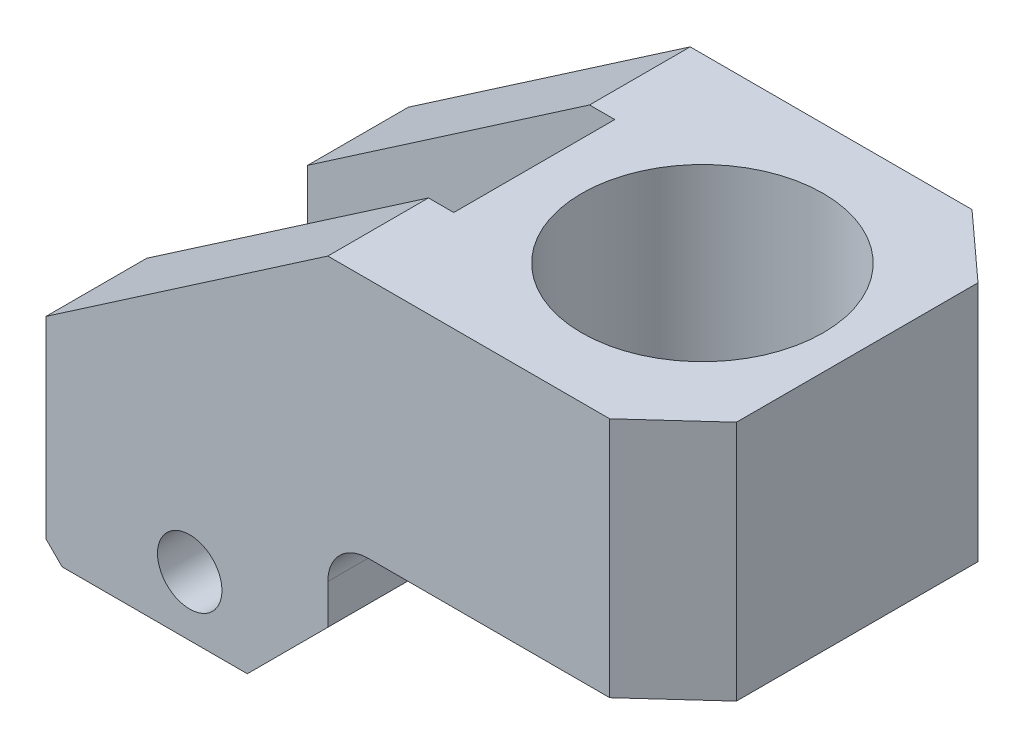
ISO-10303-21;
HEADER;
FILE_DESCRIPTION(('STEP AP214'),'2;1');
FILE_NAME('part.step','',(''),(''),'','','');
FILE_SCHEMA(('AUTOMOTIVE_DESIGN { 1 0 10303 214 1 1 1 1 }'));
ENDSEC;
DATA;
#1=APPLICATION_CONTEXT('core data for automotive mechanical design processes');
#2=APPLICATION_PROTOCOL_DEFINITION('international standard','automotive_design',2000,#1);
#3=PRODUCT_CONTEXT('',#1,'mechanical');
#4=PRODUCT('Part','Part','',(#3));
#5=PRODUCT_RELATED_PRODUCT_CATEGORY('part','',(#4));
#6=PRODUCT_DEFINITION_FORMATION('','',#4);
#7=PRODUCT_DEFINITION_CONTEXT('part definition',#1,'design');
#8=PRODUCT_DEFINITION('design','',#6,#7);
#9=PRODUCT_DEFINITION_SHAPE('','',#8);
#10=(LENGTH_UNIT() NAMED_UNIT(*) SI_UNIT(.MILLI.,.METRE.));
#11=(NAMED_UNIT(*) PLANE_ANGLE_UNIT() SI_UNIT($,.RADIAN.));
#12=(NAMED_UNIT(*) SI_UNIT($,.STERADIAN.) SOLID_ANGLE_UNIT());
#13=UNCERTAINTY_MEASURE_WITH_UNIT(LENGTH_MEASURE(1.E-05),#10,'distance_accuracy_value','');
#14=(GEOMETRIC_REPRESENTATION_CONTEXT(3) GLOBAL_UNCERTAINTY_ASSIGNED_CONTEXT((#13)) GLOBAL_UNIT_ASSIGNED_CONTEXT((#10,
#11,#12)) REPRESENTATION_CONTEXT('',''));
#15=CARTESIAN_POINT('',(0.,0.,0.));
#16=DIRECTION('',(0.,0.,1.));
#17=DIRECTION('',(1.,0.,0.));
#18=AXIS2_PLACEMENT_3D('',#15,#16,#17);
#19=CARTESIAN_POINT('',(-24.019063341913,30.,22.5));
#20=DIRECTION('',(-0.565326975135233,0.824866905133457,0.));
#21=DIRECTION('',(-0.824866905133457,-0.565326975135233,0.));
#22=AXIS2_PLACEMENT_3D('',#19,#20,#21);
#23=PLANE('',#22);
#24=DIRECTION('',(0.824866905133457,0.565326975135233,0.));
#25=VECTOR('',#24,1.);
#26=CARTESIAN_POINT('',(-24.019063341913,30.,10.));
#27=LINE('',#26,#25);
#28=CARTESIAN_POINT('',(-59.019063341913,6.01256153375207,10.));
#29=VERTEX_POINT('',#28);
#30=CARTESIAN_POINT('',(-24.019063341913,30.,10.));
#31=VERTEX_POINT('',#30);
#32=EDGE_CURVE('E209',#29,#31,#27,.T.);
#33=ORIENTED_EDGE('',*,*,#32,.F.);
#34=DIRECTION('',(0.,0.,-1.));
#35=VECTOR('',#34,1.);
#36=CARTESIAN_POINT('',(-59.019063341913,6.01256153375207,22.5));
#37=LINE('',#36,#35);
#38=CARTESIAN_POINT('',(-59.019063341913,6.01256153375207,22.5));
#39=VERTEX_POINT('',#38);
#40=EDGE_CURVE('E263',#39,#29,#37,.T.);
#41=ORIENTED_EDGE('',*,*,#40,.F.);
#42=DIRECTION('',(0.824866905133457,0.565326975135233,0.));
#43=VECTOR('',#42,1.);
#44=CARTESIAN_POINT('',(-24.019063341913,30.,22.5));
#45=LINE('',#44,#43);
#46=CARTESIAN_POINT('',(-24.019063341913,30.,22.5));
#47=VERTEX_POINT('',#46);
#48=EDGE_CURVE('E212',#39,#47,#45,.T.);
#49=ORIENTED_EDGE('',*,*,#48,.T.);
#50=DIRECTION('',(0.,0.,1.));
#51=VECTOR('',#50,1.);
#52=CARTESIAN_POINT('',(-24.019063341913,30.,-22.5));
#53=LINE('',#52,#51);
#54=EDGE_CURVE('E282',#31,#47,#53,.T.);
#55=ORIENTED_EDGE('',*,*,#54,.F.);
#56=EDGE_LOOP('',(#33,#41,#49,#55));
#57=FACE_BOUND('',#56,.T.);
#58=ADVANCED_FACE('F31',(#57),#23,.T.);
#59=CARTESIAN_POINT('',(-59.019063341913,-19.9275306984768,22.5));
#60=DIRECTION('',(-1.,0.,0.));
#61=DIRECTION('',(0.,0.,1.));
#62=AXIS2_PLACEMENT_3D('',#59,#60,#61);
#63=PLANE('',#62);
#64=DIRECTION('',(0.,1.,0.));
#65=VECTOR('',#64,1.);
#66=CARTESIAN_POINT('',(-59.019063341913,-19.9275306984768,10.));
#67=LINE('',#66,#65);
#68=CARTESIAN_POINT('',(-59.019063341913,-17.9275306984768,10.));
#69=VERTEX_POINT('',#68);
#70=EDGE_CURVE('E202',#69,#29,#67,.T.);
#71=ORIENTED_EDGE('',*,*,#70,.F.);
#72=DIRECTION('',(0.,0.,1.));
#73=VECTOR('',#72,1.);
#74=CARTESIAN_POINT('',(-59.019063341913,-17.9275306984768,22.5));
#75=LINE('',#74,#73);
#76=CARTESIAN_POINT('',(-59.019063341913,-17.9275306984768,22.5));
#77=VERTEX_POINT('',#76);
#78=EDGE_CURVE('E579',#69,#77,#75,.T.);
#79=ORIENTED_EDGE('',*,*,#78,.T.);
#80=DIRECTION('',(0.,1.,0.));
#81=VECTOR('',#80,1.);
#82=CARTESIAN_POINT('',(-59.019063341913,-19.9275306984768,22.5));
#83=LINE('',#82,#81);
#84=EDGE_CURVE('E608',#77,#39,#83,.T.);
#85=ORIENTED_EDGE('',*,*,#84,.T.);
#86=ORIENTED_EDGE('',*,*,#40,.T.);
#87=EDGE_LOOP('',(#71,#79,#85,#86));
#88=FACE_BOUND('',#87,.T.);
#89=ADVANCED_FACE('F362',(#88),#63,.T.);
#90=CARTESIAN_POINT('',(-59.019063341913,-19.9275306984768,22.5));
#91=DIRECTION('',(0.,-1.,0.));
#92=DIRECTION('',(0.,0.,-1.));
#93=AXIS2_PLACEMENT_3D('',#90,#91,#92);
#94=PLANE('',#93);
#95=DIRECTION('',(-1.,0.,0.));
#96=VECTOR('',#95,1.);
#97=CARTESIAN_POINT('',(-59.019063341913,-19.9275306984768,10.));
#98=LINE('',#97,#96);
#99=CARTESIAN_POINT('',(-34.019063341913,-19.9275306984768,10.));
#100=VERTEX_POINT('',#99);
#101=CARTESIAN_POINT('',(-57.019063341913,-19.9275306984768,10.));
#102=VERTEX_POINT('',#101);
#103=EDGE_CURVE('E199',#100,#102,#98,.T.);
#104=ORIENTED_EDGE('',*,*,#103,.F.);
#105=DIRECTION('',(0.,0.,1.));
#106=VECTOR('',#105,1.);
#107=CARTESIAN_POINT('',(-34.019063341913,-19.9275306984768,22.5));
#108=LINE('',#107,#106);
#109=CARTESIAN_POINT('',(-34.019063341913,-19.9275306984768,22.5));
#110=VERTEX_POINT('',#109);
#111=EDGE_CURVE('E39',#100,#110,#108,.T.);
#112=ORIENTED_EDGE('',*,*,#111,.T.);
#113=DIRECTION('',(-1.,0.,0.));
#114=VECTOR('',#113,1.);
#115=CARTESIAN_POINT('',(-59.019063341913,-19.9275306984768,22.5));
#116=LINE('',#115,#114);
#117=CARTESIAN_POINT('',(-57.019063341913,-19.9275306984768,22.5));
#118=VERTEX_POINT('',#117);
#119=EDGE_CURVE('E219',#110,#118,#116,.T.);
#120=ORIENTED_EDGE('',*,*,#119,.T.);
#121=DIRECTION('',(0.,0.,-1.));
#122=VECTOR('',#121,1.);
#123=CARTESIAN_POINT('',(-57.019063341913,-19.9275306984768,22.5));
#124=LINE('',#123,#122);
#125=EDGE_CURVE('E574',#118,#102,#124,.T.);
#126=ORIENTED_EDGE('',*,*,#125,.T.);
#127=EDGE_LOOP('',(#104,#112,#120,#126));
#128=FACE_BOUND('',#127,.T.);
#129=ADVANCED_FACE('F368',(#128),#94,.T.);
#130=CARTESIAN_POINT('',(-24.019063341913,-19.9275306984768,22.5));
#131=DIRECTION('',(1.,0.,0.));
#132=DIRECTION('',(0.,0.,-1.));
#133=AXIS2_PLACEMENT_3D('',#130,#131,#132);
#134=PLANE('',#133);
#135=DIRECTION('',(0.,-1.,0.));
#136=VECTOR('',#135,1.);
#137=CARTESIAN_POINT('',(-24.019063341913,-19.9275306984768,22.5));
#138=LINE('',#137,#136);
#139=CARTESIAN_POINT('',(-24.019063341913,-5.,22.5));
#140=VERTEX_POINT('',#139);
#141=CARTESIAN_POINT('',(-24.019063341913,-9.92753069847682,22.5));
#142=VERTEX_POINT('',#141);
#143=EDGE_CURVE('E215',#140,#142,#138,.T.);
#144=ORIENTED_EDGE('',*,*,#143,.T.);
#145=DIRECTION('',(0.,0.,-1.));
#146=VECTOR('',#145,1.);
#147=CARTESIAN_POINT('',(-24.019063341913,-9.92753069847682,22.5));
#148=LINE('',#147,#146);
#149=CARTESIAN_POINT('',(-24.019063341913,-9.92753069847682,10.));
#150=VERTEX_POINT('',#149);
#151=EDGE_CURVE('E549',#142,#150,#148,.T.);
#152=ORIENTED_EDGE('',*,*,#151,.T.);
#153=DIRECTION('',(0.,-1.,0.));
#154=VECTOR('',#153,1.);
#155=CARTESIAN_POINT('',(-24.019063341913,-19.9275306984768,10.));
#156=LINE('',#155,#154);
#157=CARTESIAN_POINT('',(-24.019063341913,-5.,10.));
#158=VERTEX_POINT('',#157);
#159=EDGE_CURVE('E248',#158,#150,#156,.T.);
#160=ORIENTED_EDGE('',*,*,#159,.F.);
#161=DIRECTION('',(0.,0.,-1.));
#162=VECTOR('',#161,1.);
#163=CARTESIAN_POINT('',(-24.019063341913,-5.,16.25));
#164=LINE('',#163,#162);
#165=EDGE_CURVE('E227',#158,#140,#164,.F.);
#166=ORIENTED_EDGE('',*,*,#165,.T.);
#167=EDGE_LOOP('',(#144,#152,#160,#166));
#168=FACE_BOUND('',#167,.T.);
#169=ADVANCED_FACE('F478',(#168),#134,.T.);
#170=CARTESIAN_POINT('',(10.9809366580871,30.,22.5));
#171=DIRECTION('',(-0.67300654170394,0.,-0.739636528859752));
#172=DIRECTION('',(-0.739636528859752,0.,0.67300654170394));
#173=AXIS2_PLACEMENT_3D('',#170,#171,#172);
#174=PLANE('',#173);
#175=DIRECTION('',(0.739636528859752,0.,-0.67300654170394));
#176=VECTOR('',#175,1.);
#177=CARTESIAN_POINT('',(10.9809366580871,0.,22.5));
#178=LINE('',#177,#176);
#179=CARTESIAN_POINT('',(10.9809366580871,0.,22.5));
#180=VERTEX_POINT('',#179);
#181=CARTESIAN_POINT('',(19.2234627298298,0.,15.));
#182=VERTEX_POINT('',#181);
#183=EDGE_CURVE('E271',#180,#182,#178,.T.);
#184=ORIENTED_EDGE('',*,*,#183,.T.);
#185=DIRECTION('',(0.,-1.,0.));
#186=VECTOR('',#185,1.);
#187=CARTESIAN_POINT('',(19.2234627298298,30.,15.));
#188=LINE('',#187,#186);
#189=CARTESIAN_POINT('',(19.2234627298298,30.,15.));
#190=VERTEX_POINT('',#189);
#191=EDGE_CURVE('E239',#190,#182,#188,.T.);
#192=ORIENTED_EDGE('',*,*,#191,.F.);
#193=DIRECTION('',(0.739636528859752,0.,-0.67300654170394));
#194=VECTOR('',#193,1.);
#195=CARTESIAN_POINT('',(10.9809366580871,30.,22.5));
#196=LINE('',#195,#194);
#197=CARTESIAN_POINT('',(10.9809366580871,30.,22.5));
#198=VERTEX_POINT('',#197);
#199=EDGE_CURVE('E233',#198,#190,#196,.T.);
#200=ORIENTED_EDGE('',*,*,#199,.F.);
#201=DIRECTION('',(0.,-1.,0.));
#202=VECTOR('',#201,1.);
#203=CARTESIAN_POINT('',(10.9809366580871,30.,22.5));
#204=LINE('',#203,#202);
#205=EDGE_CURVE('E286',#198,#180,#204,.T.);
#206=ORIENTED_EDGE('',*,*,#205,.T.);
#207=EDGE_LOOP('',(#184,#192,#200,#206));
#208=FACE_BOUND('',#207,.T.);
#209=ADVANCED_FACE('F309',(#208),#174,.F.);
#210=CARTESIAN_POINT('',(19.2234627298298,30.,-15.));
#211=DIRECTION('',(-1.,0.,0.));
#212=DIRECTION('',(0.,0.,1.));
#213=AXIS2_PLACEMENT_3D('',#210,#211,#212);
#214=PLANE('',#213);
#215=DIRECTION('',(0.,0.,-1.));
#216=VECTOR('',#215,1.);
#217=CARTESIAN_POINT('',(19.2234627298298,0.,-15.));
#218=LINE('',#217,#216);
#219=CARTESIAN_POINT('',(19.2234627298298,0.,-15.));
#220=VERTEX_POINT('',#219);
#221=EDGE_CURVE('E289',#182,#220,#218,.T.);
#222=ORIENTED_EDGE('',*,*,#221,.T.);
#223=DIRECTION('',(0.,-1.,0.));
#224=VECTOR('',#223,1.);
#225=CARTESIAN_POINT('',(19.2234627298298,30.,-15.));
#226=LINE('',#225,#224);
#227=CARTESIAN_POINT('',(19.2234627298298,30.,-15.));
#228=VERTEX_POINT('',#227);
#229=EDGE_CURVE('E296',#228,#220,#226,.T.);
#230=ORIENTED_EDGE('',*,*,#229,.F.);
#231=DIRECTION('',(0.,0.,-1.));
#232=VECTOR('',#231,1.);
#233=CARTESIAN_POINT('',(19.2234627298298,30.,-15.));
#234=LINE('',#233,#232);
#235=EDGE_CURVE('E276',#190,#228,#234,.T.);
#236=ORIENTED_EDGE('',*,*,#235,.F.);
#237=ORIENTED_EDGE('',*,*,#191,.T.);
#238=EDGE_LOOP('',(#222,#230,#236,#237));
#239=FACE_BOUND('',#238,.T.);
#240=ADVANCED_FACE('F305',(#239),#214,.F.);
#241=CARTESIAN_POINT('',(10.9809366580871,30.,-22.5));
#242=DIRECTION('',(-0.67300654170394,0.,0.739636528859752));
#243=DIRECTION('',(0.739636528859752,0.,0.67300654170394));
#244=AXIS2_PLACEMENT_3D('',#241,#242,#243);
#245=PLANE('',#244);
#246=DIRECTION('',(-0.739636528859752,0.,-0.67300654170394));
#247=VECTOR('',#246,1.);
#248=CARTESIAN_POINT('',(10.9809366580871,0.,-22.5));
#249=LINE('',#248,#247);
#250=CARTESIAN_POINT('',(10.9809366580871,0.,-22.5));
#251=VERTEX_POINT('',#250);
#252=EDGE_CURVE('E243',#220,#251,#249,.T.);
#253=ORIENTED_EDGE('',*,*,#252,.T.);
#254=DIRECTION('',(0.,-1.,0.));
#255=VECTOR('',#254,1.);
#256=CARTESIAN_POINT('',(10.9809366580871,30.,-22.5));
#257=LINE('',#256,#255);
#258=CARTESIAN_POINT('',(10.9809366580871,30.,-22.5));
#259=VERTEX_POINT('',#258);
#260=EDGE_CURVE('E294',#259,#251,#257,.T.);
#261=ORIENTED_EDGE('',*,*,#260,.F.);
#262=DIRECTION('',(-0.739636528859752,0.,-0.67300654170394));
#263=VECTOR('',#262,1.);
#264=CARTESIAN_POINT('',(10.9809366580871,30.,-22.5));
#265=LINE('',#264,#263);
#266=EDGE_CURVE('E278',#228,#259,#265,.T.);
#267=ORIENTED_EDGE('',*,*,#266,.F.);
#268=ORIENTED_EDGE('',*,*,#229,.T.);
#269=EDGE_LOOP('',(#253,#261,#267,#268));
#270=FACE_BOUND('',#269,.T.);
#271=ADVANCED_FACE('F318',(#270),#245,.F.);
#272=CARTESIAN_POINT('',(-24.019063341913,30.,-22.5));
#273=DIRECTION('',(0.,0.,1.));
#274=DIRECTION('',(1.,0.,0.));
#275=AXIS2_PLACEMENT_3D('',#272,#273,#274);
#276=PLANE('',#275);
#277=CARTESIAN_POINT('',(-41.1704943946339,-12.5474412438957,-22.5));
#278=DIRECTION('',(0.,0.,-1.));
#279=DIRECTION('',(-1.,0.,0.));
#280=AXIS2_PLACEMENT_3D('',#277,#278,#279);
#281=CIRCLE('',#280,3.99999999676854);
#282=CARTESIAN_POINT('',(-45.1704943914024,-12.5474412438957,-22.5));
#283=VERTEX_POINT('',#282);
#284=EDGE_CURVE('E253',#283,#283,#281,.T.);
#285=ORIENTED_EDGE('',*,*,#284,.F.);
#286=EDGE_LOOP('',(#285));
#287=FACE_BOUND('',#286,.T.);
#288=DIRECTION('',(0.,-1.,0.));
#289=VECTOR('',#288,1.);
#290=CARTESIAN_POINT('',(-24.019063341913,-19.9275306984768,-22.5));
#291=LINE('',#290,#289);
#292=CARTESIAN_POINT('',(-24.019063341913,-5.,-22.5));
#293=VERTEX_POINT('',#292);
#294=CARTESIAN_POINT('',(-24.019063341913,-9.92753069847682,-22.5));
#295=VERTEX_POINT('',#294);
#296=EDGE_CURVE('E254',#293,#295,#291,.T.);
#297=ORIENTED_EDGE('',*,*,#296,.T.);
#298=DIRECTION('',(0.707106781186549,0.707106781186546,0.));
#299=VECTOR('',#298,1.);
#300=CARTESIAN_POINT('',(-24.019063341913,-9.92753069847682,-22.5));
#301=LINE('',#300,#299);
#302=CARTESIAN_POINT('',(-34.019063341913,-19.9275306984768,-22.5));
#303=VERTEX_POINT('',#302);
#304=EDGE_CURVE('E586',#295,#303,#301,.F.);
#305=ORIENTED_EDGE('',*,*,#304,.T.);
#306=DIRECTION('',(-1.,0.,0.));
#307=VECTOR('',#306,1.);
#308=CARTESIAN_POINT('',(-59.019063341913,-19.9275306984768,-22.5));
#309=LINE('',#308,#307);
#310=CARTESIAN_POINT('',(-57.019063341913,-19.9275306984768,-22.5));
#311=VERTEX_POINT('',#310);
#312=EDGE_CURVE('E257',#303,#311,#309,.T.);
#313=ORIENTED_EDGE('',*,*,#312,.T.);
#314=DIRECTION('',(0.707106781186545,-0.70710678118655,0.));
#315=VECTOR('',#314,1.);
#316=CARTESIAN_POINT('',(-57.019063341913,-19.9275306984768,-22.5));
#317=LINE('',#316,#315);
#318=CARTESIAN_POINT('',(-59.019063341913,-17.9275306984768,-22.5));
#319=VERTEX_POINT('',#318);
#320=EDGE_CURVE('E569',#311,#319,#317,.F.);
#321=ORIENTED_EDGE('',*,*,#320,.T.);
#322=DIRECTION('',(0.,1.,0.));
#323=VECTOR('',#322,1.);
#324=CARTESIAN_POINT('',(-59.019063341913,-19.9275306984768,-22.5));
#325=LINE('',#324,#323);
#326=CARTESIAN_POINT('',(-59.019063341913,6.01256153375207,-22.5));
#327=VERTEX_POINT('',#326);
#328=EDGE_CURVE('E216',#319,#327,#325,.T.);
#329=ORIENTED_EDGE('',*,*,#328,.T.);
#330=DIRECTION('',(0.824866905133457,0.565326975135233,0.));
#331=VECTOR('',#330,1.);
#332=CARTESIAN_POINT('',(-24.019063341913,30.,-22.5));
#333=LINE('',#332,#331);
#334=CARTESIAN_POINT('',(-24.019063341913,30.,-22.5));
#335=VERTEX_POINT('',#334);
#336=EDGE_CURVE('E182',#327,#335,#333,.T.);
#337=ORIENTED_EDGE('',*,*,#336,.T.);
#338=DIRECTION('',(-1.,0.,0.));
#339=VECTOR('',#338,1.);
#340=CARTESIAN_POINT('',(-24.019063341913,30.,-22.5));
#341=LINE('',#340,#339);
#342=EDGE_CURVE('E280',#259,#335,#341,.T.);
#343=ORIENTED_EDGE('',*,*,#342,.F.);
#344=ORIENTED_EDGE('',*,*,#260,.T.);
#345=DIRECTION('',(-1.,0.,0.));
#346=VECTOR('',#345,1.);
#347=CARTESIAN_POINT('',(-24.019063341913,0.,-22.5));
#348=LINE('',#347,#346);
#349=CARTESIAN_POINT('',(-19.019063341913,0.,-22.5));
#350=VERTEX_POINT('',#349);
#351=EDGE_CURVE('E234',#251,#350,#348,.T.);
#352=ORIENTED_EDGE('',*,*,#351,.T.);
#353=CARTESIAN_POINT('',(-19.019063341913,-5.,-22.5));
#354=DIRECTION('',(0.,0.,1.));
#355=DIRECTION('',(1.,0.,0.));
#356=AXIS2_PLACEMENT_3D('',#353,#354,#355);
#357=CIRCLE('',#356,5.);
#358=EDGE_CURVE('E559',#350,#293,#357,.T.);
#359=ORIENTED_EDGE('',*,*,#358,.T.);
#360=EDGE_LOOP('',(#297,#305,#313,#321,#329,#337,#343,#344,#352,#359));
#361=FACE_BOUND('',#360,.T.);
#362=ADVANCED_FACE('F321',(#287,#361),#276,.F.);
#363=CARTESIAN_POINT('',(-24.019063341913,30.,22.5));
#364=DIRECTION('',(0.,0.,-1.));
#365=DIRECTION('',(-1.,0.,0.));
#366=AXIS2_PLACEMENT_3D('',#363,#364,#365);
#367=PLANE('',#366);
#368=CARTESIAN_POINT('',(-41.1704943946339,-12.5474412438957,22.5));
#369=DIRECTION('',(0.,0.,-1.));
#370=DIRECTION('',(-1.,0.,0.));
#371=AXIS2_PLACEMENT_3D('',#368,#369,#370);
#372=CIRCLE('',#371,3.99999999676854);
#373=CARTESIAN_POINT('',(-45.1704943914024,-12.5474412438957,22.5));
#374=VERTEX_POINT('',#373);
#375=EDGE_CURVE('E193',#374,#374,#372,.T.);
#376=ORIENTED_EDGE('',*,*,#375,.T.);
#377=EDGE_LOOP('',(#376));
#378=FACE_BOUND('',#377,.T.);
#379=ORIENTED_EDGE('',*,*,#119,.F.);
#380=DIRECTION('',(-0.707106781186549,-0.707106781186546,0.));
#381=VECTOR('',#380,1.);
#382=CARTESIAN_POINT('',(-24.019063341913,-9.92753069847682,22.5));
#383=LINE('',#382,#381);
#384=EDGE_CURVE('E11',#110,#142,#383,.F.);
#385=ORIENTED_EDGE('',*,*,#384,.T.);
#386=ORIENTED_EDGE('',*,*,#143,.F.);
#387=CARTESIAN_POINT('',(-19.019063341913,-5.,22.5));
#388=DIRECTION('',(0.,0.,-1.));
#389=DIRECTION('',(-1.,0.,0.));
#390=AXIS2_PLACEMENT_3D('',#387,#388,#389);
#391=CIRCLE('',#390,5.);
#392=CARTESIAN_POINT('',(-19.019063341913,0.,22.5));
#393=VERTEX_POINT('',#392);
#394=EDGE_CURVE('E558',#140,#393,#391,.T.);
#395=ORIENTED_EDGE('',*,*,#394,.T.);
#396=DIRECTION('',(1.,0.,0.));
#397=VECTOR('',#396,1.);
#398=CARTESIAN_POINT('',(-24.019063341913,0.,22.5));
#399=LINE('',#398,#397);
#400=EDGE_CURVE('E230',#393,#180,#399,.T.);
#401=ORIENTED_EDGE('',*,*,#400,.T.);
#402=ORIENTED_EDGE('',*,*,#205,.F.);
#403=DIRECTION('',(1.,0.,0.));
#404=VECTOR('',#403,1.);
#405=CARTESIAN_POINT('',(-24.019063341913,30.,22.5));
#406=LINE('',#405,#404);
#407=EDGE_CURVE('E284',#47,#198,#406,.T.);
#408=ORIENTED_EDGE('',*,*,#407,.F.);
#409=ORIENTED_EDGE('',*,*,#48,.F.);
#410=ORIENTED_EDGE('',*,*,#84,.F.);
#411=DIRECTION('',(-0.707106781186545,0.70710678118655,0.));
#412=VECTOR('',#411,1.);
#413=CARTESIAN_POINT('',(-57.019063341913,-19.9275306984768,22.5));
#414=LINE('',#413,#412);
#415=EDGE_CURVE('E581',#77,#118,#414,.F.);
#416=ORIENTED_EDGE('',*,*,#415,.T.);
#417=EDGE_LOOP('',(#379,#385,#386,#395,#401,#402,#408,#409,#410,#416));
#418=FACE_BOUND('',#417,.T.);
#419=ADVANCED_FACE('F352',(#378,#418),#367,.F.);
#420=CARTESIAN_POINT('',(35.7085148733153,30.,0.));
#421=DIRECTION('',(0.,-1.,0.));
#422=DIRECTION('',(0.,0.,-1.));
#423=AXIS2_PLACEMENT_3D('',#420,#421,#422);
#424=PLANE('',#423);
#425=CARTESIAN_POINT('',(0.,30.,0.));
#426=DIRECTION('',(0.,1.,0.));
#427=DIRECTION('',(0.,0.,1.));
#428=AXIS2_PLACEMENT_3D('',#425,#426,#427);
#429=CIRCLE('',#428,15.);
#430=CARTESIAN_POINT('',(0.,30.,15.));
#431=VERTEX_POINT('',#430);
#432=EDGE_CURVE('E266',#431,#431,#429,.T.);
#433=ORIENTED_EDGE('',*,*,#432,.F.);
#434=EDGE_LOOP('',(#433));
#435=FACE_BOUND('',#434,.T.);
#436=DIRECTION('',(0.,0.,1.));
#437=VECTOR('',#436,1.);
#438=CARTESIAN_POINT('',(-20.8824295978616,30.,0.));
#439=LINE('',#438,#437);
#440=CARTESIAN_POINT('',(-20.8824295978616,30.,-10.));
#441=VERTEX_POINT('',#440);
#442=CARTESIAN_POINT('',(-20.8824295978616,30.,10.));
#443=VERTEX_POINT('',#442);
#444=EDGE_CURVE('E172',#441,#443,#439,.T.);
#445=ORIENTED_EDGE('',*,*,#444,.T.);
#446=DIRECTION('',(-1.,0.,0.));
#447=VECTOR('',#446,1.);
#448=CARTESIAN_POINT('',(35.7085148733153,30.,10.));
#449=LINE('',#448,#447);
#450=EDGE_CURVE('E183',#443,#31,#449,.T.);
#451=ORIENTED_EDGE('',*,*,#450,.T.);
#452=ORIENTED_EDGE('',*,*,#54,.T.);
#453=ORIENTED_EDGE('',*,*,#407,.T.);
#454=ORIENTED_EDGE('',*,*,#199,.T.);
#455=ORIENTED_EDGE('',*,*,#235,.T.);
#456=ORIENTED_EDGE('',*,*,#266,.T.);
#457=ORIENTED_EDGE('',*,*,#342,.T.);
#458=CARTESIAN_POINT('',(-24.019063341913,30.,-10.));
#459=VERTEX_POINT('',#458);
#460=EDGE_CURVE('E198',#335,#459,#53,.T.);
#461=ORIENTED_EDGE('',*,*,#460,.T.);
#462=DIRECTION('',(1.,0.,0.));
#463=VECTOR('',#462,1.);
#464=CARTESIAN_POINT('',(35.7085148733153,30.,-10.));
#465=LINE('',#464,#463);
#466=EDGE_CURVE('E188',#459,#441,#465,.T.);
#467=ORIENTED_EDGE('',*,*,#466,.T.);
#468=EDGE_LOOP('',(#445,#451,#452,#453,#454,#455,#456,#457,#461,#467));
#469=FACE_BOUND('',#468,.T.);
#470=ADVANCED_FACE('F196',(#435,#469),#424,.F.);
#471=CARTESIAN_POINT('',(35.7085148733153,0.,0.));
#472=DIRECTION('',(0.,-1.,0.));
#473=DIRECTION('',(0.,0.,-1.));
#474=AXIS2_PLACEMENT_3D('',#471,#472,#473);
#475=PLANE('',#474);
#476=ORIENTED_EDGE('',*,*,#400,.F.);
#477=DIRECTION('',(0.,0.,1.));
#478=VECTOR('',#477,1.);
#479=CARTESIAN_POINT('',(-19.019063341913,0.,-22.5));
#480=LINE('',#479,#478);
#481=EDGE_CURVE('E229',#393,#350,#480,.F.);
#482=ORIENTED_EDGE('',*,*,#481,.T.);
#483=ORIENTED_EDGE('',*,*,#351,.F.);
#484=ORIENTED_EDGE('',*,*,#252,.F.);
#485=ORIENTED_EDGE('',*,*,#221,.F.);
#486=ORIENTED_EDGE('',*,*,#183,.F.);
#487=EDGE_LOOP('',(#476,#482,#483,#484,#485,#486));
#488=FACE_BOUND('',#487,.T.);
#489=CARTESIAN_POINT('',(0.,0.,0.));
#490=DIRECTION('',(0.,1.,0.));
#491=DIRECTION('',(0.,0.,1.));
#492=AXIS2_PLACEMENT_3D('',#489,#490,#491);
#493=CIRCLE('',#492,15.);
#494=CARTESIAN_POINT('',(0.,0.,15.));
#495=VERTEX_POINT('',#494);
#496=EDGE_CURVE('E268',#495,#495,#493,.T.);
#497=ORIENTED_EDGE('',*,*,#496,.T.);
#498=EDGE_LOOP('',(#497));
#499=FACE_BOUND('',#498,.T.);
#500=ADVANCED_FACE('F313',(#488,#499),#475,.T.);
#501=CARTESIAN_POINT('',(0.,0.,0.));
#502=DIRECTION('',(0.,1.,0.));
#503=DIRECTION('',(0.,0.,1.));
#504=AXIS2_PLACEMENT_3D('',#501,#502,#503);
#505=CYLINDRICAL_SURFACE('',#504,15.);
#506=ORIENTED_EDGE('',*,*,#496,.F.);
#507=EDGE_LOOP('',(#506));
#508=FACE_BOUND('',#507,.T.);
#509=ORIENTED_EDGE('',*,*,#432,.T.);
#510=EDGE_LOOP('',(#509));
#511=FACE_BOUND('',#510,.T.);
#512=ADVANCED_FACE('F375',(#508,#511),#505,.F.);
#513=DIRECTION('',(-0.824866905133457,-0.565326975135233,0.));
#514=VECTOR('',#513,1.);
#515=CARTESIAN_POINT('',(-24.019063341913,30.,-10.));
#516=LINE('',#515,#514);
#517=CARTESIAN_POINT('',(-59.019063341913,6.01256153375207,-10.));
#518=VERTEX_POINT('',#517);
#519=EDGE_CURVE('E200',#459,#518,#516,.T.);
#520=ORIENTED_EDGE('',*,*,#519,.F.);
#521=ORIENTED_EDGE('',*,*,#460,.F.);
#522=ORIENTED_EDGE('',*,*,#336,.F.);
#523=EDGE_CURVE('E267',#518,#327,#37,.T.);
#524=ORIENTED_EDGE('',*,*,#523,.F.);
#525=EDGE_LOOP('',(#520,#521,#522,#524));
#526=FACE_BOUND('',#525,.T.);
#527=ADVANCED_FACE('F326',(#526),#23,.T.);
#528=ORIENTED_EDGE('',*,*,#328,.F.);
#529=DIRECTION('',(0.,0.,1.));
#530=VECTOR('',#529,1.);
#531=CARTESIAN_POINT('',(-59.019063341913,-17.9275306984768,22.5));
#532=LINE('',#531,#530);
#533=CARTESIAN_POINT('',(-59.019063341913,-17.9275306984768,-10.));
#534=VERTEX_POINT('',#533);
#535=EDGE_CURVE('E336',#319,#534,#532,.T.);
#536=ORIENTED_EDGE('',*,*,#535,.T.);
#537=DIRECTION('',(0.,-1.,0.));
#538=VECTOR('',#537,1.);
#539=CARTESIAN_POINT('',(-59.019063341913,-19.9275306984768,-10.));
#540=LINE('',#539,#538);
#541=EDGE_CURVE('E204',#518,#534,#540,.T.);
#542=ORIENTED_EDGE('',*,*,#541,.F.);
#543=ORIENTED_EDGE('',*,*,#523,.T.);
#544=EDGE_LOOP('',(#528,#536,#542,#543));
#545=FACE_BOUND('',#544,.T.);
#546=ADVANCED_FACE('F334',(#545),#63,.T.);
#547=ORIENTED_EDGE('',*,*,#312,.F.);
#548=DIRECTION('',(0.,0.,1.));
#549=VECTOR('',#548,1.);
#550=CARTESIAN_POINT('',(-34.019063341913,-19.9275306984768,22.5));
#551=LINE('',#550,#549);
#552=CARTESIAN_POINT('',(-34.019063341913,-19.9275306984768,-10.));
#553=VERTEX_POINT('',#552);
#554=EDGE_CURVE('E588',#303,#553,#551,.T.);
#555=ORIENTED_EDGE('',*,*,#554,.T.);
#556=DIRECTION('',(1.,0.,0.));
#557=VECTOR('',#556,1.);
#558=CARTESIAN_POINT('',(-59.019063341913,-19.9275306984768,-10.));
#559=LINE('',#558,#557);
#560=CARTESIAN_POINT('',(-57.019063341913,-19.9275306984768,-10.));
#561=VERTEX_POINT('',#560);
#562=EDGE_CURVE('E337',#561,#553,#559,.T.);
#563=ORIENTED_EDGE('',*,*,#562,.F.);
#564=DIRECTION('',(0.,0.,-1.));
#565=VECTOR('',#564,1.);
#566=CARTESIAN_POINT('',(-57.019063341913,-19.9275306984768,22.5));
#567=LINE('',#566,#565);
#568=EDGE_CURVE('E561',#561,#311,#567,.T.);
#569=ORIENTED_EDGE('',*,*,#568,.T.);
#570=EDGE_LOOP('',(#547,#555,#563,#569));
#571=FACE_BOUND('',#570,.T.);
#572=ADVANCED_FACE('F380',(#571),#94,.T.);
#573=DIRECTION('',(0.,1.,0.));
#574=VECTOR('',#573,1.);
#575=CARTESIAN_POINT('',(-24.019063341913,-19.9275306984768,-10.));
#576=LINE('',#575,#574);
#577=CARTESIAN_POINT('',(-24.019063341913,-9.92753069847682,-10.));
#578=VERTEX_POINT('',#577);
#579=CARTESIAN_POINT('',(-24.019063341913,-5.,-10.));
#580=VERTEX_POINT('',#579);
#581=EDGE_CURVE('E246',#578,#580,#576,.T.);
#582=ORIENTED_EDGE('',*,*,#581,.F.);
#583=DIRECTION('',(0.,0.,-1.));
#584=VECTOR('',#583,1.);
#585=CARTESIAN_POINT('',(-24.019063341913,-9.92753069847682,22.5));
#586=LINE('',#585,#584);
#587=EDGE_CURVE('E583',#578,#295,#586,.T.);
#588=ORIENTED_EDGE('',*,*,#587,.T.);
#589=ORIENTED_EDGE('',*,*,#296,.F.);
#590=DIRECTION('',(0.,0.,1.));
#591=VECTOR('',#590,1.);
#592=CARTESIAN_POINT('',(-24.019063341913,-5.,-10.));
#593=LINE('',#592,#591);
#594=EDGE_CURVE('E225',#293,#580,#593,.T.);
#595=ORIENTED_EDGE('',*,*,#594,.T.);
#596=EDGE_LOOP('',(#582,#588,#589,#595));
#597=FACE_BOUND('',#596,.T.);
#598=ADVANCED_FACE('F417',(#597),#134,.T.);
#599=CARTESIAN_POINT('',(-20.8824295978616,-30.,-10.));
#600=DIRECTION('',(1.,0.,0.));
#601=DIRECTION('',(0.,0.,-1.));
#602=AXIS2_PLACEMENT_3D('',#599,#600,#601);
#603=PLANE('',#602);
#604=DIRECTION('',(0.,1.,0.));
#605=VECTOR('',#604,1.);
#606=CARTESIAN_POINT('',(-20.8824295978616,-30.,-10.));
#607=LINE('',#606,#605);
#608=CARTESIAN_POINT('',(-20.8824295978616,-0.360186836068505,-10.));
#609=VERTEX_POINT('',#608);
#610=EDGE_CURVE('E176',#609,#441,#607,.T.);
#611=ORIENTED_EDGE('',*,*,#610,.F.);
#612=DIRECTION('',(0.,0.,-1.));
#613=VECTOR('',#612,1.);
#614=CARTESIAN_POINT('',(-20.8824295978616,-0.360186836068503,-10.));
#615=LINE('',#614,#613);
#616=CARTESIAN_POINT('',(-20.8824295978616,-0.360186836068505,10.));
#617=VERTEX_POINT('',#616);
#618=EDGE_CURVE('E563',#609,#617,#615,.F.);
#619=ORIENTED_EDGE('',*,*,#618,.T.);
#620=DIRECTION('',(0.,1.,0.));
#621=VECTOR('',#620,1.);
#622=CARTESIAN_POINT('',(-20.8824295978616,-30.,10.));
#623=LINE('',#622,#621);
#624=EDGE_CURVE('E178',#617,#443,#623,.T.);
#625=ORIENTED_EDGE('',*,*,#624,.T.);
#626=ORIENTED_EDGE('',*,*,#444,.F.);
#627=EDGE_LOOP('',(#611,#619,#625,#626));
#628=FACE_BOUND('',#627,.T.);
#629=ADVANCED_FACE('F174',(#628),#603,.F.);
#630=CARTESIAN_POINT('',(-65.5391185987355,-30.,10.));
#631=DIRECTION('',(0.,0.,1.));
#632=DIRECTION('',(1.,0.,0.));
#633=AXIS2_PLACEMENT_3D('',#630,#631,#632);
#634=PLANE('',#633);
#635=CARTESIAN_POINT('',(-41.1704943946339,-12.5474412438957,10.));
#636=DIRECTION('',(0.,0.,1.));
#637=DIRECTION('',(1.,0.,0.));
#638=AXIS2_PLACEMENT_3D('',#635,#636,#637);
#639=CIRCLE('',#638,3.99999999676854);
#640=CARTESIAN_POINT('',(-37.1704943978653,-12.5474412438957,10.));
#641=VERTEX_POINT('',#640);
#642=EDGE_CURVE('E252',#641,#641,#639,.T.);
#643=ORIENTED_EDGE('',*,*,#642,.T.);
#644=EDGE_LOOP('',(#643));
#645=FACE_BOUND('',#644,.T.);
#646=ORIENTED_EDGE('',*,*,#159,.T.);
#647=DIRECTION('',(0.707106781186549,0.707106781186546,0.));
#648=VECTOR('',#647,1.);
#649=CARTESIAN_POINT('',(-24.019063341913,-9.92753069847682,10.));
#650=LINE('',#649,#648);
#651=EDGE_CURVE('E53',#150,#100,#650,.F.);
#652=ORIENTED_EDGE('',*,*,#651,.T.);
#653=ORIENTED_EDGE('',*,*,#103,.T.);
#654=DIRECTION('',(0.707106781186545,-0.70710678118655,0.));
#655=VECTOR('',#654,1.);
#656=CARTESIAN_POINT('',(-57.019063341913,-19.9275306984768,10.));
#657=LINE('',#656,#655);
#658=EDGE_CURVE('E577',#102,#69,#657,.F.);
#659=ORIENTED_EDGE('',*,*,#658,.T.);
#660=ORIENTED_EDGE('',*,*,#70,.T.);
#661=ORIENTED_EDGE('',*,*,#32,.T.);
#662=ORIENTED_EDGE('',*,*,#450,.F.);
#663=ORIENTED_EDGE('',*,*,#624,.F.);
#664=CARTESIAN_POINT('',(-19.019063341913,-5.,10.));
#665=DIRECTION('',(0.,0.,1.));
#666=DIRECTION('',(1.,0.,0.));
#667=AXIS2_PLACEMENT_3D('',#664,#665,#666);
#668=CIRCLE('',#667,5.);
#669=EDGE_CURVE('E557',#617,#158,#668,.T.);
#670=ORIENTED_EDGE('',*,*,#669,.T.);
#671=EDGE_LOOP('',(#646,#652,#653,#659,#660,#661,#662,#663,#670));
#672=FACE_BOUND('',#671,.T.);
#673=ADVANCED_FACE('F416',(#645,#672),#634,.F.);
#674=CARTESIAN_POINT('',(-65.5391185987355,-30.,-10.));
#675=DIRECTION('',(0.,0.,-1.));
#676=DIRECTION('',(-1.,0.,0.));
#677=AXIS2_PLACEMENT_3D('',#674,#675,#676);
#678=PLANE('',#677);
#679=CARTESIAN_POINT('',(-41.1704943946339,-12.5474412438957,-10.));
#680=DIRECTION('',(0.,0.,-1.));
#681=DIRECTION('',(-1.,0.,0.));
#682=AXIS2_PLACEMENT_3D('',#679,#680,#681);
#683=CIRCLE('',#682,3.99999999676854);
#684=CARTESIAN_POINT('',(-45.1704943914024,-12.5474412438957,-10.));
#685=VERTEX_POINT('',#684);
#686=EDGE_CURVE('E250',#685,#685,#683,.T.);
#687=ORIENTED_EDGE('',*,*,#686,.T.);
#688=EDGE_LOOP('',(#687));
#689=FACE_BOUND('',#688,.T.);
#690=ORIENTED_EDGE('',*,*,#562,.T.);
#691=DIRECTION('',(-0.707106781186549,-0.707106781186546,0.));
#692=VECTOR('',#691,1.);
#693=CARTESIAN_POINT('',(-24.019063341913,-9.92753069847682,-10.));
#694=LINE('',#693,#692);
#695=EDGE_CURVE('E590',#553,#578,#694,.F.);
#696=ORIENTED_EDGE('',*,*,#695,.T.);
#697=ORIENTED_EDGE('',*,*,#581,.T.);
#698=CARTESIAN_POINT('',(-19.019063341913,-5.,-10.));
#699=DIRECTION('',(0.,0.,-1.));
#700=DIRECTION('',(-1.,0.,0.));
#701=AXIS2_PLACEMENT_3D('',#698,#699,#700);
#702=CIRCLE('',#701,5.);
#703=EDGE_CURVE('E191',#580,#609,#702,.T.);
#704=ORIENTED_EDGE('',*,*,#703,.T.);
#705=ORIENTED_EDGE('',*,*,#610,.T.);
#706=ORIENTED_EDGE('',*,*,#466,.F.);
#707=ORIENTED_EDGE('',*,*,#519,.T.);
#708=ORIENTED_EDGE('',*,*,#541,.T.);
#709=DIRECTION('',(-0.707106781186545,0.70710678118655,0.));
#710=VECTOR('',#709,1.);
#711=CARTESIAN_POINT('',(-57.019063341913,-19.9275306984768,-10.));
#712=LINE('',#711,#710);
#713=EDGE_CURVE('E572',#534,#561,#712,.F.);
#714=ORIENTED_EDGE('',*,*,#713,.T.);
#715=EDGE_LOOP('',(#690,#696,#697,#704,#705,#706,#707,#708,#714));
#716=FACE_BOUND('',#715,.T.);
#717=ADVANCED_FACE('F187',(#689,#716),#678,.F.);
#718=CARTESIAN_POINT('',(-41.1704943946339,-12.5474412438957,22.50005));
#719=DIRECTION('',(0.,0.,-1.));
#720=DIRECTION('',(-1.,0.,0.));
#721=AXIS2_PLACEMENT_3D('',#718,#719,#720);
#722=CYLINDRICAL_SURFACE('',#721,3.99999999676854);
#723=ORIENTED_EDGE('',*,*,#284,.T.);
#724=EDGE_LOOP('',(#723));
#725=FACE_BOUND('',#724,.T.);
#726=ORIENTED_EDGE('',*,*,#686,.F.);
#727=EDGE_LOOP('',(#726));
#728=FACE_BOUND('',#727,.T.);
#729=ADVANCED_FACE('F348',(#725,#728),#722,.F.);
#730=ORIENTED_EDGE('',*,*,#642,.F.);
#731=EDGE_LOOP('',(#730));
#732=FACE_BOUND('',#731,.T.);
#733=ORIENTED_EDGE('',*,*,#375,.F.);
#734=EDGE_LOOP('',(#733));
#735=FACE_BOUND('',#734,.T.);
#736=ADVANCED_FACE('F407',(#732,#735),#722,.F.);
#737=CARTESIAN_POINT('',(-19.019063341913,-5.,22.5));
#738=DIRECTION('',(0.,0.,-1.));
#739=DIRECTION('',(-1.,0.,0.));
#740=AXIS2_PLACEMENT_3D('',#737,#738,#739);
#741=CYLINDRICAL_SURFACE('',#740,5.);
#742=ORIENTED_EDGE('',*,*,#358,.F.);
#743=ORIENTED_EDGE('',*,*,#481,.F.);
#744=ORIENTED_EDGE('',*,*,#394,.F.);
#745=ORIENTED_EDGE('',*,*,#165,.F.);
#746=ORIENTED_EDGE('',*,*,#669,.F.);
#747=ORIENTED_EDGE('',*,*,#618,.F.);
#748=ORIENTED_EDGE('',*,*,#703,.F.);
#749=ORIENTED_EDGE('',*,*,#594,.F.);
#750=EDGE_LOOP('',(#742,#743,#744,#745,#746,#747,#748,#749));
#751=FACE_BOUND('',#750,.T.);
#752=ADVANCED_FACE('F426',(#751),#741,.F.);
#753=CARTESIAN_POINT('',(-57.019063341913,-19.9275306984768,22.5));
#754=DIRECTION('',(0.70710678118655,0.707106781186545,0.));
#755=DIRECTION('',(-0.707106781186545,0.70710678118655,0.));
#756=AXIS2_PLACEMENT_3D('',#753,#754,#755);
#757=PLANE('',#756);
#758=ORIENTED_EDGE('',*,*,#713,.F.);
#759=ORIENTED_EDGE('',*,*,#535,.F.);
#760=ORIENTED_EDGE('',*,*,#320,.F.);
#761=ORIENTED_EDGE('',*,*,#568,.F.);
#762=EDGE_LOOP('',(#758,#759,#760,#761));
#763=FACE_BOUND('',#762,.T.);
#764=ADVANCED_FACE('F431',(#763),#757,.F.);
#765=CARTESIAN_POINT('',(-57.019063341913,-19.9275306984768,22.5));
#766=DIRECTION('',(0.70710678118655,0.707106781186545,0.));
#767=DIRECTION('',(-0.707106781186545,0.70710678118655,0.));
#768=AXIS2_PLACEMENT_3D('',#765,#766,#767);
#769=PLANE('',#768);
#770=ORIENTED_EDGE('',*,*,#415,.F.);
#771=ORIENTED_EDGE('',*,*,#78,.F.);
#772=ORIENTED_EDGE('',*,*,#658,.F.);
#773=ORIENTED_EDGE('',*,*,#125,.F.);
#774=EDGE_LOOP('',(#770,#771,#772,#773));
#775=FACE_BOUND('',#774,.T.);
#776=ADVANCED_FACE('F458',(#775),#769,.F.);
#777=CARTESIAN_POINT('',(-24.019063341913,-9.92753069847682,22.5));
#778=DIRECTION('',(-0.707106781186546,0.707106781186549,0.));
#779=DIRECTION('',(-0.707106781186549,-0.707106781186546,0.));
#780=AXIS2_PLACEMENT_3D('',#777,#778,#779);
#781=PLANE('',#780);
#782=ORIENTED_EDGE('',*,*,#695,.F.);
#783=ORIENTED_EDGE('',*,*,#554,.F.);
#784=ORIENTED_EDGE('',*,*,#304,.F.);
#785=ORIENTED_EDGE('',*,*,#587,.F.);
#786=EDGE_LOOP('',(#782,#783,#784,#785));
#787=FACE_BOUND('',#786,.T.);
#788=ADVANCED_FACE('F468',(#787),#781,.F.);
#789=CARTESIAN_POINT('',(-24.019063341913,-9.92753069847682,22.5));
#790=DIRECTION('',(-0.707106781186546,0.707106781186549,0.));
#791=DIRECTION('',(-0.707106781186549,-0.707106781186546,0.));
#792=AXIS2_PLACEMENT_3D('',#789,#790,#791);
#793=PLANE('',#792);
#794=ORIENTED_EDGE('',*,*,#384,.F.);
#795=ORIENTED_EDGE('',*,*,#111,.F.);
#796=ORIENTED_EDGE('',*,*,#651,.F.);
#797=ORIENTED_EDGE('',*,*,#151,.F.);
#798=EDGE_LOOP('',(#794,#795,#796,#797));
#799=FACE_BOUND('',#798,.T.);
#800=ADVANCED_FACE('F33',(#799),#793,.F.);
#801=CLOSED_SHELL('',(#58,#89,#129,#169,#209,#240,#271,#362,#419,#470,#500,#512,#527,#546,#572,
#598,#629,#673,#717,#729,#736,#752,#764,#776,#788,#800));
#802=MANIFOLD_SOLID_BREP('B2',#801);
#803=ADVANCED_BREP_SHAPE_REPRESENTATION('',(#18,#802),#14);
#804=SHAPE_DEFINITION_REPRESENTATION(#9,#803);
ENDSEC;
END-ISO-10303-21;
